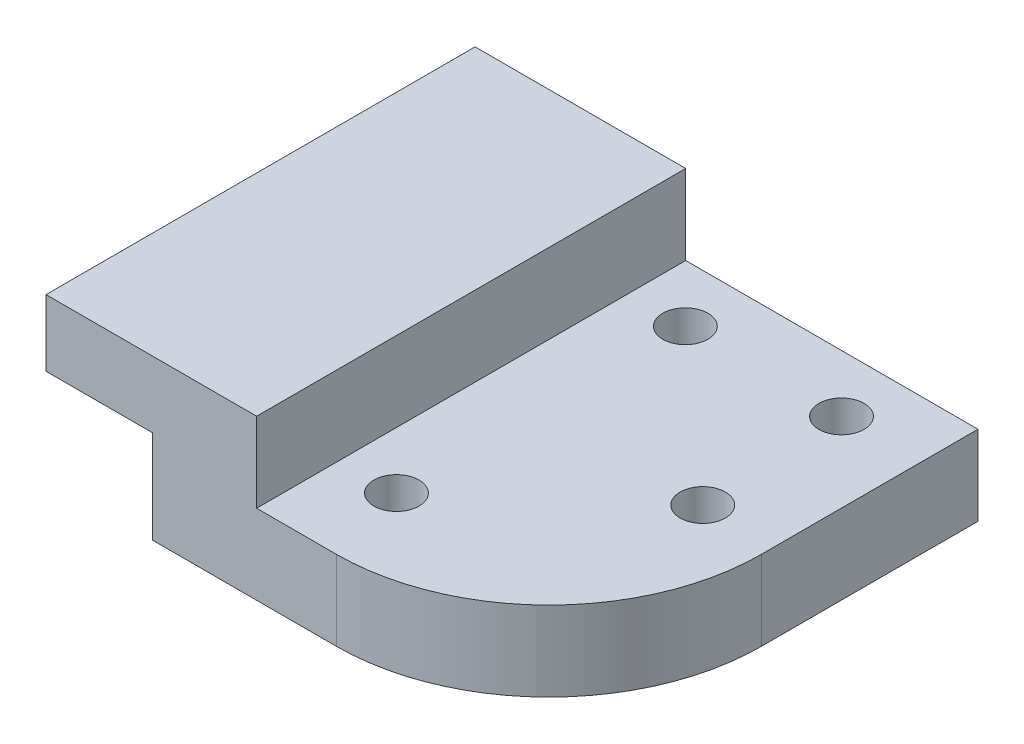
ISO-10303-21;
HEADER;
FILE_DESCRIPTION(('STEP AP214'),'2;1');
FILE_NAME('part.step','',(''),(''),'','','');
FILE_SCHEMA(('AUTOMOTIVE_DESIGN { 1 0 10303 214 1 1 1 1 }'));
ENDSEC;
DATA;
#1=APPLICATION_CONTEXT('core data for automotive mechanical design processes');
#2=APPLICATION_PROTOCOL_DEFINITION('international standard','automotive_design',2000,#1);
#3=PRODUCT_CONTEXT('',#1,'mechanical');
#4=PRODUCT('Part','Part','',(#3));
#5=PRODUCT_RELATED_PRODUCT_CATEGORY('part','',(#4));
#6=PRODUCT_DEFINITION_FORMATION('','',#4);
#7=PRODUCT_DEFINITION_CONTEXT('part definition',#1,'design');
#8=PRODUCT_DEFINITION('design','',#6,#7);
#9=PRODUCT_DEFINITION_SHAPE('','',#8);
#10=(LENGTH_UNIT() NAMED_UNIT(*) SI_UNIT(.MILLI.,.METRE.));
#11=(NAMED_UNIT(*) PLANE_ANGLE_UNIT() SI_UNIT($,.RADIAN.));
#12=(NAMED_UNIT(*) SI_UNIT($,.STERADIAN.) SOLID_ANGLE_UNIT());
#13=UNCERTAINTY_MEASURE_WITH_UNIT(LENGTH_MEASURE(1.E-05),#10,'distance_accuracy_value','');
#14=(GEOMETRIC_REPRESENTATION_CONTEXT(3) GLOBAL_UNCERTAINTY_ASSIGNED_CONTEXT((#13)) GLOBAL_UNIT_ASSIGNED_CONTEXT((#10,
#11,#12)) REPRESENTATION_CONTEXT('',''));
#15=CARTESIAN_POINT('',(0.,0.,0.));
#16=DIRECTION('',(0.,0.,1.));
#17=DIRECTION('',(1.,0.,0.));
#18=AXIS2_PLACEMENT_3D('',#15,#16,#17);
#19=CARTESIAN_POINT('',(7.92727272727273,3.,20.));
#20=DIRECTION('',(-1.,0.,0.));
#21=DIRECTION('',(0.,0.,1.));
#22=AXIS2_PLACEMENT_3D('',#19,#20,#21);
#23=PLANE('',#22);
#24=DIRECTION('',(0.,-1.,0.));
#25=VECTOR('',#24,1.);
#26=CARTESIAN_POINT('',(7.92727272727273,3.,0.85));
#27=LINE('',#26,#25);
#28=CARTESIAN_POINT('',(7.92727272727273,3.,0.85));
#29=VERTEX_POINT('',#28);
#30=CARTESIAN_POINT('',(7.92727272727273,0.,0.85));
#31=VERTEX_POINT('',#30);
#32=EDGE_CURVE('E224',#29,#31,#27,.T.);
#33=ORIENTED_EDGE('',*,*,#32,.F.);
#34=DIRECTION('',(0.,0.,-1.));
#35=VECTOR('',#34,1.);
#36=CARTESIAN_POINT('',(7.92727272727273,3.,20.));
#37=LINE('',#36,#35);
#38=CARTESIAN_POINT('',(7.92727272727273,3.,17.));
#39=VERTEX_POINT('',#38);
#40=EDGE_CURVE('E156',#39,#29,#37,.T.);
#41=ORIENTED_EDGE('',*,*,#40,.F.);
#42=DIRECTION('',(0.,1.,0.));
#43=VECTOR('',#42,1.);
#44=CARTESIAN_POINT('',(7.92727272727273,3.,17.));
#45=LINE('',#44,#43);
#46=CARTESIAN_POINT('',(7.92727272727273,0.,17.));
#47=VERTEX_POINT('',#46);
#48=EDGE_CURVE('E189',#47,#39,#45,.T.);
#49=ORIENTED_EDGE('',*,*,#48,.F.);
#50=DIRECTION('',(0.,0.,-1.));
#51=VECTOR('',#50,1.);
#52=CARTESIAN_POINT('',(7.92727272727273,0.,20.));
#53=LINE('',#52,#51);
#54=EDGE_CURVE('E160',#47,#31,#53,.T.);
#55=ORIENTED_EDGE('',*,*,#54,.T.);
#56=EDGE_LOOP('',(#33,#41,#49,#55));
#57=FACE_BOUND('',#56,.T.);
#58=ADVANCED_FACE('F43',(#57),#23,.F.);
#59=CARTESIAN_POINT('',(0.,0.,20.));
#60=DIRECTION('',(1.,0.,0.));
#61=DIRECTION('',(0.,1.,0.));
#62=AXIS2_PLACEMENT_3D('',#59,#60,#61);
#63=PLANE('',#62);
#64=DIRECTION('',(0.,1.,0.));
#65=VECTOR('',#64,1.);
#66=CARTESIAN_POINT('',(0.,0.,0.85));
#67=LINE('',#66,#65);
#68=CARTESIAN_POINT('',(0.,0.5,0.85));
#69=VERTEX_POINT('',#68);
#70=CARTESIAN_POINT('',(0.,3.,0.85));
#71=VERTEX_POINT('',#70);
#72=EDGE_CURVE('E216',#69,#71,#67,.T.);
#73=ORIENTED_EDGE('',*,*,#72,.F.);
#74=DIRECTION('',(0.,0.,-1.));
#75=VECTOR('',#74,1.);
#76=CARTESIAN_POINT('',(0.,0.5,20.));
#77=LINE('',#76,#75);
#78=CARTESIAN_POINT('',(0.,0.5,17.));
#79=VERTEX_POINT('',#78);
#80=EDGE_CURVE('E140',#79,#69,#77,.T.);
#81=ORIENTED_EDGE('',*,*,#80,.F.);
#82=DIRECTION('',(0.,-1.,0.));
#83=VECTOR('',#82,1.);
#84=CARTESIAN_POINT('',(0.,0.,17.));
#85=LINE('',#84,#83);
#86=CARTESIAN_POINT('',(0.,3.,17.));
#87=VERTEX_POINT('',#86);
#88=EDGE_CURVE('E136',#87,#79,#85,.T.);
#89=ORIENTED_EDGE('',*,*,#88,.F.);
#90=DIRECTION('',(0.,0.,-1.));
#91=VECTOR('',#90,1.);
#92=CARTESIAN_POINT('',(0.,3.,20.));
#93=LINE('',#92,#91);
#94=EDGE_CURVE('E152',#87,#71,#93,.T.);
#95=ORIENTED_EDGE('',*,*,#94,.T.);
#96=EDGE_LOOP('',(#73,#81,#89,#95));
#97=FACE_BOUND('',#96,.T.);
#98=ADVANCED_FACE('F210',(#97),#63,.F.);
#99=CARTESIAN_POINT('',(4.,-3.,20.));
#100=DIRECTION('',(1.,0.,0.));
#101=DIRECTION('',(0.,0.,-1.));
#102=AXIS2_PLACEMENT_3D('',#99,#100,#101);
#103=PLANE('',#102);
#104=DIRECTION('',(0.,1.,0.));
#105=VECTOR('',#104,1.);
#106=CARTESIAN_POINT('',(4.,-3.,0.85));
#107=LINE('',#106,#105);
#108=CARTESIAN_POINT('',(4.,-3.,0.85));
#109=VERTEX_POINT('',#108);
#110=CARTESIAN_POINT('',(4.,0.5,0.85));
#111=VERTEX_POINT('',#110);
#112=EDGE_CURVE('E128',#109,#111,#107,.T.);
#113=ORIENTED_EDGE('',*,*,#112,.F.);
#114=DIRECTION('',(0.,0.,-1.));
#115=VECTOR('',#114,1.);
#116=CARTESIAN_POINT('',(4.,-3.,20.));
#117=LINE('',#116,#115);
#118=CARTESIAN_POINT('',(4.,-3.,17.));
#119=VERTEX_POINT('',#118);
#120=EDGE_CURVE('E126',#119,#109,#117,.T.);
#121=ORIENTED_EDGE('',*,*,#120,.F.);
#122=DIRECTION('',(0.,-1.,0.));
#123=VECTOR('',#122,1.);
#124=CARTESIAN_POINT('',(4.,-3.,17.));
#125=LINE('',#124,#123);
#126=CARTESIAN_POINT('',(4.,0.5,17.));
#127=VERTEX_POINT('',#126);
#128=EDGE_CURVE('E184',#127,#119,#125,.T.);
#129=ORIENTED_EDGE('',*,*,#128,.F.);
#130=DIRECTION('',(0.,0.,1.));
#131=VECTOR('',#130,1.);
#132=CARTESIAN_POINT('',(4.,0.5,20.));
#133=LINE('',#132,#131);
#134=EDGE_CURVE('E149',#111,#127,#133,.T.);
#135=ORIENTED_EDGE('',*,*,#134,.F.);
#136=EDGE_LOOP('',(#113,#121,#129,#135));
#137=FACE_BOUND('',#136,.T.);
#138=ADVANCED_FACE('F289',(#137),#103,.F.);
#139=CARTESIAN_POINT('',(15.9272727272727,-3.,20.));
#140=DIRECTION('',(0.,1.,0.));
#141=DIRECTION('',(-1.,0.,0.));
#142=AXIS2_PLACEMENT_3D('',#139,#140,#141);
#143=PLANE('',#142);
#144=CARTESIAN_POINT('',(10.0635548411017,-3.,13.8735459816755));
#145=DIRECTION('',(0.,1.,0.));
#146=DIRECTION('',(0.,0.,1.));
#147=AXIS2_PLACEMENT_3D('',#144,#145,#146);
#148=CIRCLE('',#147,0.85);
#149=CARTESIAN_POINT('',(10.0635548411017,-3.,14.7235459816755));
#150=VERTEX_POINT('',#149);
#151=EDGE_CURVE('E191',#150,#150,#148,.T.);
#152=ORIENTED_EDGE('',*,*,#151,.T.);
#153=EDGE_LOOP('',(#152));
#154=FACE_BOUND('',#153,.T.);
#155=CARTESIAN_POINT('',(16.2179874406979,-3.,8.5));
#156=DIRECTION('',(0.,1.,0.));
#157=DIRECTION('',(0.,0.,1.));
#158=AXIS2_PLACEMENT_3D('',#155,#156,#157);
#159=CIRCLE('',#158,0.85);
#160=CARTESIAN_POINT('',(16.2179874406979,-3.,9.35));
#161=VERTEX_POINT('',#160);
#162=EDGE_CURVE('E245',#161,#161,#159,.T.);
#163=ORIENTED_EDGE('',*,*,#162,.T.);
#164=EDGE_LOOP('',(#163));
#165=FACE_BOUND('',#164,.T.);
#166=CARTESIAN_POINT('',(10.0635548411017,-3.,3.));
#167=DIRECTION('',(0.,1.,0.));
#168=DIRECTION('',(0.,0.,1.));
#169=AXIS2_PLACEMENT_3D('',#166,#167,#168);
#170=CIRCLE('',#169,0.85);
#171=CARTESIAN_POINT('',(10.0635548411017,-3.,3.85));
#172=VERTEX_POINT('',#171);
#173=EDGE_CURVE('E237',#172,#172,#170,.T.);
#174=ORIENTED_EDGE('',*,*,#173,.T.);
#175=EDGE_LOOP('',(#174));
#176=FACE_BOUND('',#175,.T.);
#177=CARTESIAN_POINT('',(15.9397293500563,-3.,3.));
#178=DIRECTION('',(0.,1.,0.));
#179=DIRECTION('',(0.,0.,1.));
#180=AXIS2_PLACEMENT_3D('',#177,#178,#179);
#181=CIRCLE('',#180,0.85);
#182=CARTESIAN_POINT('',(15.9397293500563,-3.,3.85));
#183=VERTEX_POINT('',#182);
#184=EDGE_CURVE('E228',#183,#183,#181,.T.);
#185=ORIENTED_EDGE('',*,*,#184,.T.);
#186=EDGE_LOOP('',(#185));
#187=FACE_BOUND('',#186,.T.);
#188=DIRECTION('',(-1.,0.,0.));
#189=VECTOR('',#188,1.);
#190=CARTESIAN_POINT('',(15.9272727272727,-3.,0.85));
#191=LINE('',#190,#189);
#192=CARTESIAN_POINT('',(18.9272727272727,-3.,0.85));
#193=VERTEX_POINT('',#192);
#194=EDGE_CURVE('E114',#193,#109,#191,.T.);
#195=ORIENTED_EDGE('',*,*,#194,.F.);
#196=DIRECTION('',(0.,0.,-1.));
#197=VECTOR('',#196,1.);
#198=CARTESIAN_POINT('',(18.9272727272727,-3.,20.));
#199=LINE('',#198,#197);
#200=CARTESIAN_POINT('',(18.9272727272727,-3.,9.));
#201=VERTEX_POINT('',#200);
#202=EDGE_CURVE('E123',#201,#193,#199,.T.);
#203=ORIENTED_EDGE('',*,*,#202,.F.);
#204=CARTESIAN_POINT('',(10.9272727272727,-3.,9.));
#205=DIRECTION('',(0.,1.,0.));
#206=DIRECTION('',(-1.,0.,0.));
#207=AXIS2_PLACEMENT_3D('',#204,#205,#206);
#208=CIRCLE('',#207,8.);
#209=CARTESIAN_POINT('',(10.9272727272727,-3.,17.));
#210=VERTEX_POINT('',#209);
#211=EDGE_CURVE('E168',#201,#210,#208,.F.);
#212=ORIENTED_EDGE('',*,*,#211,.T.);
#213=DIRECTION('',(1.,0.,0.));
#214=VECTOR('',#213,1.);
#215=CARTESIAN_POINT('',(15.9272727272727,-3.,17.));
#216=LINE('',#215,#214);
#217=EDGE_CURVE('E180',#119,#210,#216,.T.);
#218=ORIENTED_EDGE('',*,*,#217,.F.);
#219=ORIENTED_EDGE('',*,*,#120,.T.);
#220=EDGE_LOOP('',(#195,#203,#212,#218,#219));
#221=FACE_BOUND('',#220,.T.);
#222=ADVANCED_FACE('F122',(#154,#165,#176,#187,#221),#143,.F.);
#223=CARTESIAN_POINT('',(7.92727272727273,0.,20.));
#224=DIRECTION('',(0.,-1.,0.));
#225=DIRECTION('',(0.,0.,-1.));
#226=AXIS2_PLACEMENT_3D('',#223,#224,#225);
#227=PLANE('',#226);
#228=CARTESIAN_POINT('',(10.0635548411017,0.,13.8735459816755));
#229=DIRECTION('',(0.,1.,0.));
#230=DIRECTION('',(0.,0.,1.));
#231=AXIS2_PLACEMENT_3D('',#228,#229,#230);
#232=CIRCLE('',#231,0.85);
#233=CARTESIAN_POINT('',(10.0635548411017,0.,14.7235459816755));
#234=VERTEX_POINT('',#233);
#235=EDGE_CURVE('E232',#234,#234,#232,.T.);
#236=ORIENTED_EDGE('',*,*,#235,.F.);
#237=EDGE_LOOP('',(#236));
#238=FACE_BOUND('',#237,.T.);
#239=CARTESIAN_POINT('',(16.2179874406979,0.,8.5));
#240=DIRECTION('',(0.,1.,0.));
#241=DIRECTION('',(0.,0.,1.));
#242=AXIS2_PLACEMENT_3D('',#239,#240,#241);
#243=CIRCLE('',#242,0.85);
#244=CARTESIAN_POINT('',(16.2179874406979,0.,9.35));
#245=VERTEX_POINT('',#244);
#246=EDGE_CURVE('E221',#245,#245,#243,.T.);
#247=ORIENTED_EDGE('',*,*,#246,.F.);
#248=EDGE_LOOP('',(#247));
#249=FACE_BOUND('',#248,.T.);
#250=CARTESIAN_POINT('',(10.0635548411017,0.,3.));
#251=DIRECTION('',(0.,1.,0.));
#252=DIRECTION('',(0.,0.,1.));
#253=AXIS2_PLACEMENT_3D('',#250,#251,#252);
#254=CIRCLE('',#253,0.85);
#255=CARTESIAN_POINT('',(10.0635548411017,0.,3.85));
#256=VERTEX_POINT('',#255);
#257=EDGE_CURVE('E241',#256,#256,#254,.T.);
#258=ORIENTED_EDGE('',*,*,#257,.F.);
#259=EDGE_LOOP('',(#258));
#260=FACE_BOUND('',#259,.T.);
#261=CARTESIAN_POINT('',(15.9397293500563,0.,3.));
#262=DIRECTION('',(0.,1.,0.));
#263=DIRECTION('',(0.,0.,1.));
#264=AXIS2_PLACEMENT_3D('',#261,#262,#263);
#265=CIRCLE('',#264,0.85);
#266=CARTESIAN_POINT('',(15.9397293500563,0.,3.85));
#267=VERTEX_POINT('',#266);
#268=EDGE_CURVE('E233',#267,#267,#265,.T.);
#269=ORIENTED_EDGE('',*,*,#268,.F.);
#270=EDGE_LOOP('',(#269));
#271=FACE_BOUND('',#270,.T.);
#272=DIRECTION('',(1.,0.,0.));
#273=VECTOR('',#272,1.);
#274=CARTESIAN_POINT('',(7.92727272727273,0.,0.85));
#275=LINE('',#274,#273);
#276=CARTESIAN_POINT('',(18.9272727272727,0.,0.85));
#277=VERTEX_POINT('',#276);
#278=EDGE_CURVE('E59',#31,#277,#275,.T.);
#279=ORIENTED_EDGE('',*,*,#278,.F.);
#280=ORIENTED_EDGE('',*,*,#54,.F.);
#281=DIRECTION('',(-1.,0.,0.));
#282=VECTOR('',#281,1.);
#283=CARTESIAN_POINT('',(7.92727272727273,0.,17.));
#284=LINE('',#283,#282);
#285=CARTESIAN_POINT('',(10.9272727272727,0.,17.));
#286=VERTEX_POINT('',#285);
#287=EDGE_CURVE('E178',#286,#47,#284,.T.);
#288=ORIENTED_EDGE('',*,*,#287,.F.);
#289=CARTESIAN_POINT('',(10.9272727272727,0.,9.));
#290=DIRECTION('',(0.,-1.,0.));
#291=DIRECTION('',(0.,0.,-1.));
#292=AXIS2_PLACEMENT_3D('',#289,#290,#291);
#293=CIRCLE('',#292,8.);
#294=CARTESIAN_POINT('',(18.9272727272727,0.,9.));
#295=VERTEX_POINT('',#294);
#296=EDGE_CURVE('E52',#286,#295,#293,.F.);
#297=ORIENTED_EDGE('',*,*,#296,.T.);
#298=DIRECTION('',(0.,0.,1.));
#299=VECTOR('',#298,1.);
#300=CARTESIAN_POINT('',(18.9272727272727,0.,20.));
#301=LINE('',#300,#299);
#302=EDGE_CURVE('E135',#277,#295,#301,.T.);
#303=ORIENTED_EDGE('',*,*,#302,.F.);
#304=EDGE_LOOP('',(#279,#280,#288,#297,#303));
#305=FACE_BOUND('',#304,.T.);
#306=ADVANCED_FACE('F176',(#238,#249,#260,#271,#305),#227,.F.);
#307=CARTESIAN_POINT('',(0.,3.,20.));
#308=DIRECTION('',(0.,-1.,0.));
#309=DIRECTION('',(0.,0.,-1.));
#310=AXIS2_PLACEMENT_3D('',#307,#308,#309);
#311=PLANE('',#310);
#312=DIRECTION('',(1.,0.,0.));
#313=VECTOR('',#312,1.);
#314=CARTESIAN_POINT('',(0.,3.,0.85));
#315=LINE('',#314,#313);
#316=EDGE_CURVE('E213',#71,#29,#315,.T.);
#317=ORIENTED_EDGE('',*,*,#316,.F.);
#318=ORIENTED_EDGE('',*,*,#94,.F.);
#319=DIRECTION('',(-1.,0.,0.));
#320=VECTOR('',#319,1.);
#321=CARTESIAN_POINT('',(0.,3.,17.));
#322=LINE('',#321,#320);
#323=EDGE_CURVE('E142',#39,#87,#322,.T.);
#324=ORIENTED_EDGE('',*,*,#323,.F.);
#325=ORIENTED_EDGE('',*,*,#40,.T.);
#326=EDGE_LOOP('',(#317,#318,#324,#325));
#327=FACE_BOUND('',#326,.T.);
#328=ADVANCED_FACE('F212',(#327),#311,.F.);
#329=CARTESIAN_POINT('',(0.,0.5,0.));
#330=DIRECTION('',(0.,-1.,0.));
#331=DIRECTION('',(0.,0.,-1.));
#332=AXIS2_PLACEMENT_3D('',#329,#330,#331);
#333=PLANE('',#332);
#334=ORIENTED_EDGE('',*,*,#80,.T.);
#335=DIRECTION('',(1.,0.,0.));
#336=VECTOR('',#335,1.);
#337=CARTESIAN_POINT('',(0.,0.5,0.85));
#338=LINE('',#337,#336);
#339=EDGE_CURVE('E217',#69,#111,#338,.T.);
#340=ORIENTED_EDGE('',*,*,#339,.T.);
#341=ORIENTED_EDGE('',*,*,#134,.T.);
#342=DIRECTION('',(-1.,0.,0.));
#343=VECTOR('',#342,1.);
#344=CARTESIAN_POINT('',(0.,0.5,17.));
#345=LINE('',#344,#343);
#346=EDGE_CURVE('E197',#127,#79,#345,.T.);
#347=ORIENTED_EDGE('',*,*,#346,.T.);
#348=EDGE_LOOP('',(#334,#340,#341,#347));
#349=FACE_BOUND('',#348,.T.);
#350=ADVANCED_FACE('F307',(#349),#333,.T.);
#351=CARTESIAN_POINT('',(18.9272727272727,0.,0.));
#352=DIRECTION('',(1.,0.,0.));
#353=DIRECTION('',(0.,0.,-1.));
#354=AXIS2_PLACEMENT_3D('',#351,#352,#353);
#355=PLANE('',#354);
#356=ORIENTED_EDGE('',*,*,#202,.T.);
#357=DIRECTION('',(0.,1.,0.));
#358=VECTOR('',#357,1.);
#359=CARTESIAN_POINT('',(18.9272727272727,0.,0.85));
#360=LINE('',#359,#358);
#361=EDGE_CURVE('E11',#193,#277,#360,.T.);
#362=ORIENTED_EDGE('',*,*,#361,.T.);
#363=ORIENTED_EDGE('',*,*,#302,.T.);
#364=DIRECTION('',(0.,-1.,0.));
#365=VECTOR('',#364,1.);
#366=CARTESIAN_POINT('',(18.9272727272727,0.,9.));
#367=LINE('',#366,#365);
#368=EDGE_CURVE('E133',#295,#201,#367,.T.);
#369=ORIENTED_EDGE('',*,*,#368,.T.);
#370=EDGE_LOOP('',(#356,#362,#363,#369));
#371=FACE_BOUND('',#370,.T.);
#372=ADVANCED_FACE('F131',(#371),#355,.T.);
#373=CARTESIAN_POINT('',(0.,0.,17.));
#374=DIRECTION('',(0.,0.,1.));
#375=DIRECTION('',(1.,0.,0.));
#376=AXIS2_PLACEMENT_3D('',#373,#374,#375);
#377=PLANE('',#376);
#378=ORIENTED_EDGE('',*,*,#217,.T.);
#379=DIRECTION('',(0.,-1.,0.));
#380=VECTOR('',#379,1.);
#381=CARTESIAN_POINT('',(10.9272727272727,0.,17.));
#382=LINE('',#381,#380);
#383=EDGE_CURVE('E66',#210,#286,#382,.F.);
#384=ORIENTED_EDGE('',*,*,#383,.T.);
#385=ORIENTED_EDGE('',*,*,#287,.T.);
#386=ORIENTED_EDGE('',*,*,#48,.T.);
#387=ORIENTED_EDGE('',*,*,#323,.T.);
#388=ORIENTED_EDGE('',*,*,#88,.T.);
#389=ORIENTED_EDGE('',*,*,#346,.F.);
#390=ORIENTED_EDGE('',*,*,#128,.T.);
#391=EDGE_LOOP('',(#378,#384,#385,#386,#387,#388,#389,#390));
#392=FACE_BOUND('',#391,.T.);
#393=ADVANCED_FACE('F181',(#392),#377,.T.);
#394=CARTESIAN_POINT('',(10.0635548411017,-3.,13.8735459816755));
#395=DIRECTION('',(0.,1.,0.));
#396=DIRECTION('',(0.,0.,1.));
#397=AXIS2_PLACEMENT_3D('',#394,#395,#396);
#398=CYLINDRICAL_SURFACE('',#397,0.85);
#399=ORIENTED_EDGE('',*,*,#151,.F.);
#400=EDGE_LOOP('',(#399));
#401=FACE_BOUND('',#400,.T.);
#402=ORIENTED_EDGE('',*,*,#235,.T.);
#403=EDGE_LOOP('',(#402));
#404=FACE_BOUND('',#403,.T.);
#405=ADVANCED_FACE('F258',(#401,#404),#398,.F.);
#406=CARTESIAN_POINT('',(10.9272727272727,0.,9.));
#407=DIRECTION('',(0.,-1.,0.));
#408=DIRECTION('',(0.,0.,-1.));
#409=AXIS2_PLACEMENT_3D('',#406,#407,#408);
#410=CYLINDRICAL_SURFACE('',#409,8.);
#411=ORIENTED_EDGE('',*,*,#296,.F.);
#412=ORIENTED_EDGE('',*,*,#383,.F.);
#413=ORIENTED_EDGE('',*,*,#211,.F.);
#414=ORIENTED_EDGE('',*,*,#368,.F.);
#415=EDGE_LOOP('',(#411,#412,#413,#414));
#416=FACE_BOUND('',#415,.T.);
#417=ADVANCED_FACE('F45',(#416),#410,.T.);
#418=CARTESIAN_POINT('',(16.2179874406979,-3.,8.5));
#419=DIRECTION('',(0.,1.,0.));
#420=DIRECTION('',(0.,0.,1.));
#421=AXIS2_PLACEMENT_3D('',#418,#419,#420);
#422=CYLINDRICAL_SURFACE('',#421,0.85);
#423=ORIENTED_EDGE('',*,*,#162,.F.);
#424=EDGE_LOOP('',(#423));
#425=FACE_BOUND('',#424,.T.);
#426=ORIENTED_EDGE('',*,*,#246,.T.);
#427=EDGE_LOOP('',(#426));
#428=FACE_BOUND('',#427,.T.);
#429=ADVANCED_FACE('F279',(#425,#428),#422,.F.);
#430=CARTESIAN_POINT('',(10.0635548411017,-3.,3.));
#431=DIRECTION('',(0.,1.,0.));
#432=DIRECTION('',(0.,0.,1.));
#433=AXIS2_PLACEMENT_3D('',#430,#431,#432);
#434=CYLINDRICAL_SURFACE('',#433,0.85);
#435=ORIENTED_EDGE('',*,*,#173,.F.);
#436=EDGE_LOOP('',(#435));
#437=FACE_BOUND('',#436,.T.);
#438=ORIENTED_EDGE('',*,*,#257,.T.);
#439=EDGE_LOOP('',(#438));
#440=FACE_BOUND('',#439,.T.);
#441=ADVANCED_FACE('F271',(#437,#440),#434,.F.);
#442=CARTESIAN_POINT('',(15.9397293500563,-3.,3.));
#443=DIRECTION('',(0.,1.,0.));
#444=DIRECTION('',(0.,0.,1.));
#445=AXIS2_PLACEMENT_3D('',#442,#443,#444);
#446=CYLINDRICAL_SURFACE('',#445,0.85);
#447=ORIENTED_EDGE('',*,*,#184,.F.);
#448=EDGE_LOOP('',(#447));
#449=FACE_BOUND('',#448,.T.);
#450=ORIENTED_EDGE('',*,*,#268,.T.);
#451=EDGE_LOOP('',(#450));
#452=FACE_BOUND('',#451,.T.);
#453=ADVANCED_FACE('F269',(#449,#452),#446,.F.);
#454=CARTESIAN_POINT('',(0.,0.,0.85));
#455=DIRECTION('',(0.,0.,-1.));
#456=DIRECTION('',(-1.,0.,0.));
#457=AXIS2_PLACEMENT_3D('',#454,#455,#456);
#458=PLANE('',#457);
#459=ORIENTED_EDGE('',*,*,#72,.T.);
#460=ORIENTED_EDGE('',*,*,#316,.T.);
#461=ORIENTED_EDGE('',*,*,#32,.T.);
#462=ORIENTED_EDGE('',*,*,#278,.T.);
#463=ORIENTED_EDGE('',*,*,#361,.F.);
#464=ORIENTED_EDGE('',*,*,#194,.T.);
#465=ORIENTED_EDGE('',*,*,#112,.T.);
#466=ORIENTED_EDGE('',*,*,#339,.F.);
#467=EDGE_LOOP('',(#459,#460,#461,#462,#463,#464,#465,#466));
#468=FACE_BOUND('',#467,.T.);
#469=ADVANCED_FACE('F113',(#468),#458,.T.);
#470=CLOSED_SHELL('',(#58,#98,#138,#222,#306,#328,#350,#372,#393,#405,#417,#429,#441,#453,#469));
#471=MANIFOLD_SOLID_BREP('B2',#470);
#472=ADVANCED_BREP_SHAPE_REPRESENTATION('',(#18,#471),#14);
#473=SHAPE_DEFINITION_REPRESENTATION(#9,#472);
ENDSEC;
END-ISO-10303-21;
